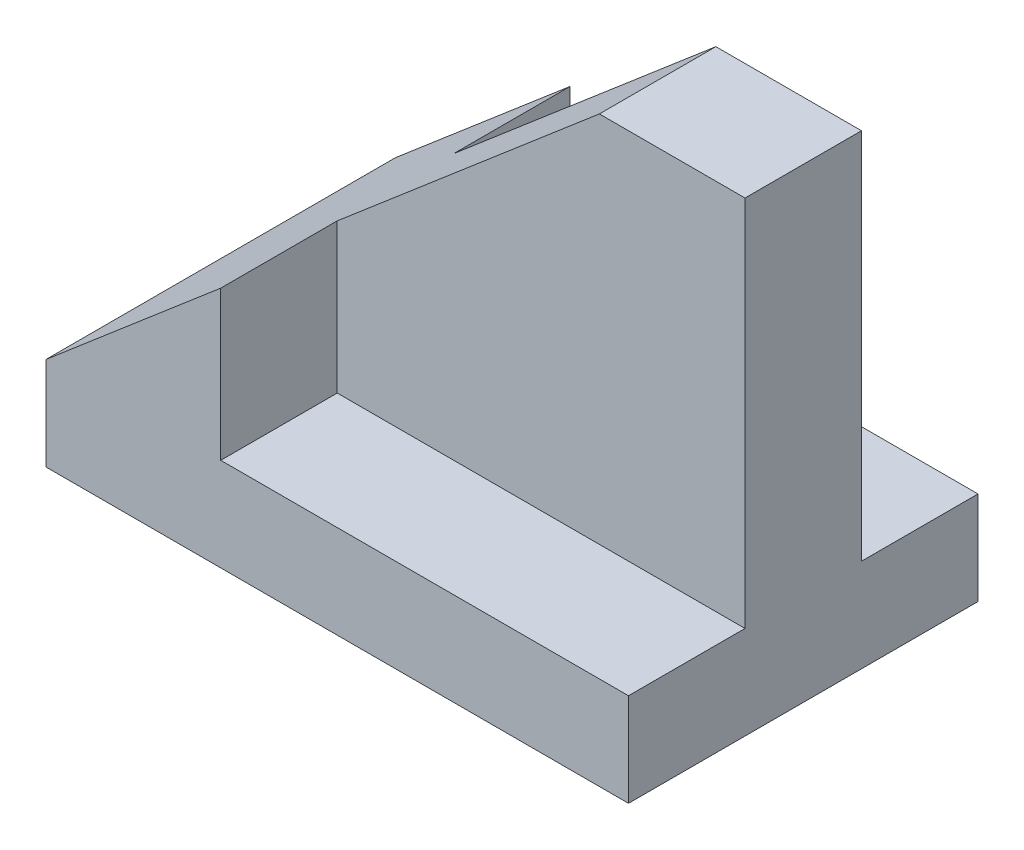
ISO-10303-21;
HEADER;
FILE_DESCRIPTION(('STEP AP214'),'2;1');
FILE_NAME('part.step','',(''),(''),'','','');
FILE_SCHEMA(('AUTOMOTIVE_DESIGN { 1 0 10303 214 1 1 1 1 }'));
ENDSEC;
DATA;
#1=APPLICATION_CONTEXT('core data for automotive mechanical design processes');
#2=APPLICATION_PROTOCOL_DEFINITION('international standard','automotive_design',2000,#1);
#3=PRODUCT_CONTEXT('',#1,'mechanical');
#4=PRODUCT('Part','Part','',(#3));
#5=PRODUCT_RELATED_PRODUCT_CATEGORY('part','',(#4));
#6=PRODUCT_DEFINITION_FORMATION('','',#4);
#7=PRODUCT_DEFINITION_CONTEXT('part definition',#1,'design');
#8=PRODUCT_DEFINITION('design','',#6,#7);
#9=PRODUCT_DEFINITION_SHAPE('','',#8);
#10=(LENGTH_UNIT() NAMED_UNIT(*) SI_UNIT(.MILLI.,.METRE.));
#11=(NAMED_UNIT(*) PLANE_ANGLE_UNIT() SI_UNIT($,.RADIAN.));
#12=(NAMED_UNIT(*) SI_UNIT($,.STERADIAN.) SOLID_ANGLE_UNIT());
#13=UNCERTAINTY_MEASURE_WITH_UNIT(LENGTH_MEASURE(1.E-05),#10,'distance_accuracy_value','');
#14=(GEOMETRIC_REPRESENTATION_CONTEXT(3) GLOBAL_UNCERTAINTY_ASSIGNED_CONTEXT((#13)) GLOBAL_UNIT_ASSIGNED_CONTEXT((#10,
#11,#12)) REPRESENTATION_CONTEXT('',''));
#15=CARTESIAN_POINT('',(0.,0.,0.));
#16=DIRECTION('',(0.,0.,1.));
#17=DIRECTION('',(1.,0.,0.));
#18=AXIS2_PLACEMENT_3D('',#15,#16,#17);
#19=CARTESIAN_POINT('',(0.,16.,0.));
#20=DIRECTION('',(0.,-1.,0.));
#21=DIRECTION('',(0.,0.,-1.));
#22=AXIS2_PLACEMENT_3D('',#19,#20,#21);
#23=PLANE('',#22);
#24=DIRECTION('',(1.,0.,0.));
#25=VECTOR('',#24,1.);
#26=CARTESIAN_POINT('',(0.,16.,40.));
#27=LINE('',#26,#25);
#28=CARTESIAN_POINT('',(30.,16.,40.));
#29=VERTEX_POINT('',#28);
#30=CARTESIAN_POINT('',(100.,16.,40.));
#31=VERTEX_POINT('',#30);
#32=EDGE_CURVE('E481',#29,#31,#27,.T.);
#33=ORIENTED_EDGE('',*,*,#32,.F.);
#34=DIRECTION('',(0.,0.,-1.));
#35=VECTOR('',#34,1.);
#36=CARTESIAN_POINT('',(30.,16.,0.));
#37=LINE('',#36,#35);
#38=CARTESIAN_POINT('',(30.,16.,60.));
#39=VERTEX_POINT('',#38);
#40=EDGE_CURVE('E597',#29,#39,#37,.F.);
#41=ORIENTED_EDGE('',*,*,#40,.T.);
#42=DIRECTION('',(-1.,0.,0.));
#43=VECTOR('',#42,1.);
#44=CARTESIAN_POINT('',(100.,16.,60.));
#45=LINE('',#44,#43);
#46=CARTESIAN_POINT('',(100.,16.,60.));
#47=VERTEX_POINT('',#46);
#48=EDGE_CURVE('E453',#47,#39,#45,.T.);
#49=ORIENTED_EDGE('',*,*,#48,.F.);
#50=DIRECTION('',(0.,0.,1.));
#51=VECTOR('',#50,1.);
#52=CARTESIAN_POINT('',(100.,16.,0.));
#53=LINE('',#52,#51);
#54=EDGE_CURVE('E86',#31,#47,#53,.T.);
#55=ORIENTED_EDGE('',*,*,#54,.F.);
#56=EDGE_LOOP('',(#33,#41,#49,#55));
#57=FACE_BOUND('',#56,.T.);
#58=ADVANCED_FACE('F67',(#57),#23,.F.);
#59=CARTESIAN_POINT('',(30.,0.,0.));
#60=DIRECTION('',(-1.,0.,0.));
#61=DIRECTION('',(0.,0.,1.));
#62=AXIS2_PLACEMENT_3D('',#59,#60,#61);
#63=PLANE('',#62);
#64=DIRECTION('',(0.,-1.,0.));
#65=VECTOR('',#64,1.);
#66=CARTESIAN_POINT('',(30.,0.,40.));
#67=LINE('',#66,#65);
#68=CARTESIAN_POINT('',(30.,41.6,40.));
#69=VERTEX_POINT('',#68);
#70=EDGE_CURVE('E12',#69,#29,#67,.T.);
#71=ORIENTED_EDGE('',*,*,#70,.F.);
#72=CARTESIAN_POINT('',(30.,41.6,40.));
#73=DIRECTION('',(0.,0.,1.));
#74=VECTOR('',#73,1.);
#75=LINE('',#72,#74);
#76=CARTESIAN_POINT('',(30.,41.6,60.));
#77=VERTEX_POINT('',#76);
#78=EDGE_CURVE('E577',#69,#77,#75,.T.);
#79=ORIENTED_EDGE('',*,*,#78,.T.);
#80=DIRECTION('',(0.,1.,0.));
#81=VECTOR('',#80,1.);
#82=CARTESIAN_POINT('',(30.,16.,60.));
#83=LINE('',#82,#81);
#84=EDGE_CURVE('E448',#39,#77,#83,.T.);
#85=ORIENTED_EDGE('',*,*,#84,.F.);
#86=ORIENTED_EDGE('',*,*,#40,.F.);
#87=EDGE_LOOP('',(#71,#79,#85,#86));
#88=FACE_BOUND('',#87,.T.);
#89=ADVANCED_FACE('F658',(#88),#63,.F.);
#90=CARTESIAN_POINT('',(30.,16.,0.));
#91=VERTEX_POINT('',#90);
#92=CARTESIAN_POINT('',(30.,16.,20.));
#93=VERTEX_POINT('',#92);
#94=EDGE_CURVE('E596',#91,#93,#37,.F.);
#95=ORIENTED_EDGE('',*,*,#94,.T.);
#96=DIRECTION('',(1.,0.,0.));
#97=VECTOR('',#96,1.);
#98=CARTESIAN_POINT('',(0.,16.,20.));
#99=LINE('',#98,#97);
#100=CARTESIAN_POINT('',(100.,16.,20.));
#101=VERTEX_POINT('',#100);
#102=EDGE_CURVE('E95',#93,#101,#99,.T.);
#103=ORIENTED_EDGE('',*,*,#102,.T.);
#104=CARTESIAN_POINT('',(100.,16.,0.));
#105=VERTEX_POINT('',#104);
#106=EDGE_CURVE('E182',#105,#101,#53,.T.);
#107=ORIENTED_EDGE('',*,*,#106,.F.);
#108=DIRECTION('',(1.,0.,0.));
#109=VECTOR('',#108,1.);
#110=CARTESIAN_POINT('',(0.,16.,0.));
#111=LINE('',#110,#109);
#112=EDGE_CURVE('E431',#91,#105,#111,.T.);
#113=ORIENTED_EDGE('',*,*,#112,.F.);
#114=EDGE_LOOP('',(#95,#103,#107,#113));
#115=FACE_BOUND('',#114,.T.);
#116=ADVANCED_FACE('F69',(#115),#23,.F.);
#117=CARTESIAN_POINT('',(0.,0.,0.));
#118=DIRECTION('',(0.,-1.,0.));
#119=DIRECTION('',(0.,0.,-1.));
#120=AXIS2_PLACEMENT_3D('',#117,#118,#119);
#121=PLANE('',#120);
#122=DIRECTION('',(0.,0.,-1.));
#123=VECTOR('',#122,1.);
#124=CARTESIAN_POINT('',(0.,0.,60.));
#125=LINE('',#124,#123);
#126=CARTESIAN_POINT('',(0.,0.,60.));
#127=VERTEX_POINT('',#126);
#128=CARTESIAN_POINT('',(0.,0.,0.));
#129=VERTEX_POINT('',#128);
#130=EDGE_CURVE('E451',#127,#129,#125,.T.);
#131=ORIENTED_EDGE('',*,*,#130,.T.);
#132=DIRECTION('',(1.,0.,0.));
#133=VECTOR('',#132,1.);
#134=CARTESIAN_POINT('',(0.,0.,0.));
#135=LINE('',#134,#133);
#136=CARTESIAN_POINT('',(100.,0.,0.));
#137=VERTEX_POINT('',#136);
#138=EDGE_CURVE('E497',#129,#137,#135,.T.);
#139=ORIENTED_EDGE('',*,*,#138,.T.);
#140=DIRECTION('',(0.,0.,1.));
#141=VECTOR('',#140,1.);
#142=CARTESIAN_POINT('',(100.,0.,0.));
#143=LINE('',#142,#141);
#144=CARTESIAN_POINT('',(100.,0.,60.));
#145=VERTEX_POINT('',#144);
#146=EDGE_CURVE('E611',#137,#145,#143,.T.);
#147=ORIENTED_EDGE('',*,*,#146,.T.);
#148=DIRECTION('',(-1.,0.,0.));
#149=VECTOR('',#148,1.);
#150=CARTESIAN_POINT('',(100.,0.,60.));
#151=LINE('',#150,#149);
#152=EDGE_CURVE('E645',#145,#127,#151,.T.);
#153=ORIENTED_EDGE('',*,*,#152,.T.);
#154=EDGE_LOOP('',(#131,#139,#147,#153));
#155=FACE_BOUND('',#154,.T.);
#156=ADVANCED_FACE('F610',(#155),#121,.T.);
#157=CARTESIAN_POINT('',(0.,0.,0.));
#158=DIRECTION('',(-1.,0.,0.));
#159=DIRECTION('',(0.,0.,1.));
#160=AXIS2_PLACEMENT_3D('',#157,#158,#159);
#161=PLANE('',#160);
#162=CARTESIAN_POINT('',(0.,0.,60.));
#163=DIRECTION('',(0.,1.,0.));
#164=VECTOR('',#163,1.);
#165=LINE('',#162,#164);
#166=CARTESIAN_POINT('',(0.,16.,60.));
#167=VERTEX_POINT('',#166);
#168=EDGE_CURVE('E502',#127,#167,#165,.T.);
#169=ORIENTED_EDGE('',*,*,#168,.T.);
#170=DIRECTION('',(0.,0.,-1.));
#171=VECTOR('',#170,1.);
#172=CARTESIAN_POINT('',(0.,16.,60.));
#173=LINE('',#172,#171);
#174=CARTESIAN_POINT('',(0.,16.,0.));
#175=VERTEX_POINT('',#174);
#176=EDGE_CURVE('E408',#167,#175,#173,.T.);
#177=ORIENTED_EDGE('',*,*,#176,.T.);
#178=CARTESIAN_POINT('',(0.,0.,0.));
#179=DIRECTION('',(0.,1.,0.));
#180=VECTOR('',#179,1.);
#181=LINE('',#178,#180);
#182=EDGE_CURVE('E492',#129,#175,#181,.T.);
#183=ORIENTED_EDGE('',*,*,#182,.F.);
#184=ORIENTED_EDGE('',*,*,#130,.F.);
#185=EDGE_LOOP('',(#169,#177,#183,#184));
#186=FACE_BOUND('',#185,.T.);
#187=ADVANCED_FACE('F521',(#186),#161,.T.);
#188=CARTESIAN_POINT('',(0.,0.,0.));
#189=DIRECTION('',(0.,0.,-1.));
#190=DIRECTION('',(-1.,0.,0.));
#191=AXIS2_PLACEMENT_3D('',#188,#189,#190);
#192=PLANE('',#191);
#193=ORIENTED_EDGE('',*,*,#182,.T.);
#194=DIRECTION('',(-0.76068664534764,-0.649119270696652,0.));
#195=VECTOR('',#194,1.);
#196=CARTESIAN_POINT('',(30.,41.6,0.));
#197=LINE('',#196,#195);
#198=CARTESIAN_POINT('',(30.,41.6,0.));
#199=VERTEX_POINT('',#198);
#200=EDGE_CURVE('E261',#199,#175,#197,.T.);
#201=ORIENTED_EDGE('',*,*,#200,.F.);
#202=DIRECTION('',(0.,1.,0.));
#203=VECTOR('',#202,1.);
#204=CARTESIAN_POINT('',(30.,16.,0.));
#205=LINE('',#204,#203);
#206=EDGE_CURVE('E434',#91,#199,#205,.T.);
#207=ORIENTED_EDGE('',*,*,#206,.F.);
#208=ORIENTED_EDGE('',*,*,#112,.T.);
#209=CARTESIAN_POINT('',(100.,0.,0.));
#210=DIRECTION('',(0.,1.,0.));
#211=VECTOR('',#210,1.);
#212=LINE('',#209,#211);
#213=EDGE_CURVE('E605',#137,#105,#212,.T.);
#214=ORIENTED_EDGE('',*,*,#213,.F.);
#215=ORIENTED_EDGE('',*,*,#138,.F.);
#216=EDGE_LOOP('',(#193,#201,#207,#208,#214,#215));
#217=FACE_BOUND('',#216,.T.);
#218=ADVANCED_FACE('F494',(#217),#192,.T.);
#219=CARTESIAN_POINT('',(0.,0.,60.));
#220=DIRECTION('',(0.,0.,1.));
#221=DIRECTION('',(1.,0.,0.));
#222=AXIS2_PLACEMENT_3D('',#219,#220,#221);
#223=PLANE('',#222);
#224=CARTESIAN_POINT('',(100.,0.,60.));
#225=DIRECTION('',(0.,1.,0.));
#226=VECTOR('',#225,1.);
#227=LINE('',#224,#226);
#228=EDGE_CURVE('E501',#145,#47,#227,.T.);
#229=ORIENTED_EDGE('',*,*,#228,.T.);
#230=ORIENTED_EDGE('',*,*,#48,.T.);
#231=ORIENTED_EDGE('',*,*,#84,.T.);
#232=DIRECTION('',(-0.76068664534764,-0.649119270696652,0.));
#233=VECTOR('',#232,1.);
#234=CARTESIAN_POINT('',(30.,41.6,60.));
#235=LINE('',#234,#233);
#236=EDGE_CURVE('E438',#77,#167,#235,.T.);
#237=ORIENTED_EDGE('',*,*,#236,.T.);
#238=ORIENTED_EDGE('',*,*,#168,.F.);
#239=ORIENTED_EDGE('',*,*,#152,.F.);
#240=EDGE_LOOP('',(#229,#230,#231,#237,#238,#239));
#241=FACE_BOUND('',#240,.T.);
#242=ADVANCED_FACE('F362',(#241),#223,.T.);
#243=CARTESIAN_POINT('',(100.,0.,0.));
#244=DIRECTION('',(1.,0.,0.));
#245=DIRECTION('',(0.,0.,-1.));
#246=AXIS2_PLACEMENT_3D('',#243,#244,#245);
#247=PLANE('',#246);
#248=ORIENTED_EDGE('',*,*,#213,.T.);
#249=ORIENTED_EDGE('',*,*,#106,.T.);
#250=DIRECTION('',(0.,1.,0.));
#251=VECTOR('',#250,1.);
#252=CARTESIAN_POINT('',(100.,16.,20.));
#253=LINE('',#252,#251);
#254=CARTESIAN_POINT('',(100.,80.,20.));
#255=VERTEX_POINT('',#254);
#256=EDGE_CURVE('E163',#101,#255,#253,.T.);
#257=ORIENTED_EDGE('',*,*,#256,.T.);
#258=CARTESIAN_POINT('',(100.,80.,20.));
#259=DIRECTION('',(0.,0.,1.));
#260=VECTOR('',#259,1.);
#261=LINE('',#258,#260);
#262=CARTESIAN_POINT('',(100.,80.,40.));
#263=VERTEX_POINT('',#262);
#264=EDGE_CURVE('E172',#255,#263,#261,.T.);
#265=ORIENTED_EDGE('',*,*,#264,.T.);
#266=DIRECTION('',(0.,1.,0.));
#267=VECTOR('',#266,1.);
#268=CARTESIAN_POINT('',(100.,16.,40.));
#269=LINE('',#268,#267);
#270=EDGE_CURVE('E262',#31,#263,#269,.T.);
#271=ORIENTED_EDGE('',*,*,#270,.F.);
#272=ORIENTED_EDGE('',*,*,#54,.T.);
#273=ORIENTED_EDGE('',*,*,#228,.F.);
#274=ORIENTED_EDGE('',*,*,#146,.F.);
#275=EDGE_LOOP('',(#248,#249,#257,#265,#271,#272,#273,#274));
#276=FACE_BOUND('',#275,.T.);
#277=ADVANCED_FACE('F178',(#276),#247,.T.);
#278=CARTESIAN_POINT('',(-7.90042176730789,9.25830675856393,0.));
#279=DIRECTION('',(0.649119270696653,-0.76068664534764,0.));
#280=DIRECTION('',(0.76068664534764,0.649119270696653,0.));
#281=AXIS2_PLACEMENT_3D('',#278,#279,#280);
#282=PLANE('',#281);
#283=ORIENTED_EDGE('',*,*,#200,.T.);
#284=ORIENTED_EDGE('',*,*,#176,.F.);
#285=ORIENTED_EDGE('',*,*,#236,.F.);
#286=ORIENTED_EDGE('',*,*,#78,.F.);
#287=DIRECTION('',(-0.76068664534764,-0.649119270696653,0.));
#288=VECTOR('',#287,1.);
#289=CARTESIAN_POINT('',(75.,80.,40.));
#290=LINE('',#289,#288);
#291=CARTESIAN_POINT('',(75.,80.,40.));
#292=VERTEX_POINT('',#291);
#293=EDGE_CURVE('E278',#292,#69,#290,.T.);
#294=ORIENTED_EDGE('',*,*,#293,.F.);
#295=CARTESIAN_POINT('',(75.,80.,20.));
#296=DIRECTION('',(0.,0.,1.));
#297=VECTOR('',#296,1.);
#298=LINE('',#295,#297);
#299=CARTESIAN_POINT('',(75.,80.,20.));
#300=VERTEX_POINT('',#299);
#301=EDGE_CURVE('E191',#300,#292,#298,.T.);
#302=ORIENTED_EDGE('',*,*,#301,.F.);
#303=DIRECTION('',(-0.76068664534764,-0.649119270696653,0.));
#304=VECTOR('',#303,1.);
#305=CARTESIAN_POINT('',(75.,80.,20.));
#306=LINE('',#305,#304);
#307=CARTESIAN_POINT('',(30.,41.6,20.));
#308=VERTEX_POINT('',#307);
#309=EDGE_CURVE('E166',#300,#308,#306,.T.);
#310=ORIENTED_EDGE('',*,*,#309,.T.);
#311=CARTESIAN_POINT('',(30.,41.6,0.));
#312=DIRECTION('',(0.,0.,1.));
#313=VECTOR('',#312,1.);
#314=LINE('',#311,#313);
#315=EDGE_CURVE('E290',#199,#308,#314,.T.);
#316=ORIENTED_EDGE('',*,*,#315,.F.);
#317=EDGE_LOOP('',(#283,#284,#285,#286,#294,#302,#310,#316));
#318=FACE_BOUND('',#317,.T.);
#319=ADVANCED_FACE('F297',(#318),#282,.F.);
#320=ORIENTED_EDGE('',*,*,#315,.T.);
#321=DIRECTION('',(0.,-1.,0.));
#322=VECTOR('',#321,1.);
#323=CARTESIAN_POINT('',(30.,0.,20.));
#324=LINE('',#323,#322);
#325=EDGE_CURVE('E78',#308,#93,#324,.T.);
#326=ORIENTED_EDGE('',*,*,#325,.T.);
#327=ORIENTED_EDGE('',*,*,#94,.F.);
#328=ORIENTED_EDGE('',*,*,#206,.T.);
#329=EDGE_LOOP('',(#320,#326,#327,#328));
#330=FACE_BOUND('',#329,.T.);
#331=ADVANCED_FACE('F306',(#330),#63,.F.);
#332=CARTESIAN_POINT('',(0.,0.,40.));
#333=DIRECTION('',(0.,0.,-1.));
#334=DIRECTION('',(-1.,0.,0.));
#335=AXIS2_PLACEMENT_3D('',#332,#333,#334);
#336=PLANE('',#335);
#337=ORIENTED_EDGE('',*,*,#293,.T.);
#338=ORIENTED_EDGE('',*,*,#70,.T.);
#339=ORIENTED_EDGE('',*,*,#32,.T.);
#340=ORIENTED_EDGE('',*,*,#270,.T.);
#341=DIRECTION('',(-1.,0.,0.));
#342=VECTOR('',#341,1.);
#343=CARTESIAN_POINT('',(100.,80.,40.));
#344=LINE('',#343,#342);
#345=EDGE_CURVE('E188',#263,#292,#344,.T.);
#346=ORIENTED_EDGE('',*,*,#345,.T.);
#347=EDGE_LOOP('',(#337,#338,#339,#340,#346));
#348=FACE_BOUND('',#347,.T.);
#349=ADVANCED_FACE('F208',(#348),#336,.F.);
#350=CARTESIAN_POINT('',(0.,0.,20.));
#351=DIRECTION('',(0.,0.,-1.));
#352=DIRECTION('',(-1.,0.,0.));
#353=AXIS2_PLACEMENT_3D('',#350,#351,#352);
#354=PLANE('',#353);
#355=ORIENTED_EDGE('',*,*,#325,.F.);
#356=ORIENTED_EDGE('',*,*,#309,.F.);
#357=DIRECTION('',(-1.,0.,0.));
#358=VECTOR('',#357,1.);
#359=CARTESIAN_POINT('',(100.,80.,20.));
#360=LINE('',#359,#358);
#361=EDGE_CURVE('E158',#255,#300,#360,.T.);
#362=ORIENTED_EDGE('',*,*,#361,.F.);
#363=ORIENTED_EDGE('',*,*,#256,.F.);
#364=ORIENTED_EDGE('',*,*,#102,.F.);
#365=EDGE_LOOP('',(#355,#356,#362,#363,#364));
#366=FACE_BOUND('',#365,.T.);
#367=ADVANCED_FACE('F162',(#366),#354,.T.);
#368=CARTESIAN_POINT('',(0.,80.,0.));
#369=DIRECTION('',(0.,-1.,0.));
#370=DIRECTION('',(0.,0.,-1.));
#371=AXIS2_PLACEMENT_3D('',#368,#369,#370);
#372=PLANE('',#371);
#373=ORIENTED_EDGE('',*,*,#301,.T.);
#374=ORIENTED_EDGE('',*,*,#345,.F.);
#375=ORIENTED_EDGE('',*,*,#264,.F.);
#376=ORIENTED_EDGE('',*,*,#361,.T.);
#377=EDGE_LOOP('',(#373,#374,#375,#376));
#378=FACE_BOUND('',#377,.T.);
#379=ADVANCED_FACE('F187',(#378),#372,.F.);
#380=CLOSED_SHELL('',(#58,#89,#116,#156,#187,#218,#242,#277,#319,#331,#349,#367,#379));
#381=MANIFOLD_SOLID_BREP('B2',#380);
#382=ADVANCED_BREP_SHAPE_REPRESENTATION('',(#18,#381),#14);
#383=SHAPE_DEFINITION_REPRESENTATION(#9,#382);
ENDSEC;
END-ISO-10303-21;
